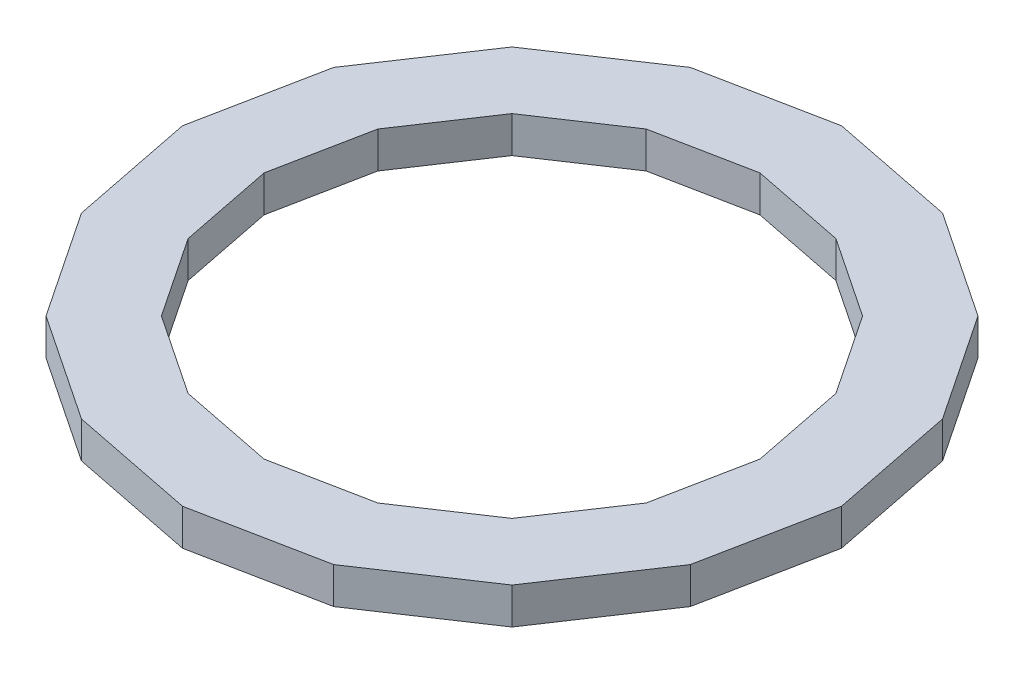
ISO-10303-21;
HEADER;
FILE_DESCRIPTION(('STEP AP214'),'2;1');
FILE_NAME('part.step','',(''),(''),'','','');
FILE_SCHEMA(('AUTOMOTIVE_DESIGN { 1 0 10303 214 1 1 1 1 }'));
ENDSEC;
DATA;
#1=APPLICATION_CONTEXT('core data for automotive mechanical design processes');
#2=APPLICATION_PROTOCOL_DEFINITION('international standard','automotive_design',2000,#1);
#3=PRODUCT_CONTEXT('',#1,'mechanical');
#4=PRODUCT('Part','Part','',(#3));
#5=PRODUCT_RELATED_PRODUCT_CATEGORY('part','',(#4));
#6=PRODUCT_DEFINITION_FORMATION('','',#4);
#7=PRODUCT_DEFINITION_CONTEXT('part definition',#1,'design');
#8=PRODUCT_DEFINITION('design','',#6,#7);
#9=PRODUCT_DEFINITION_SHAPE('','',#8);
#10=(LENGTH_UNIT() NAMED_UNIT(*) SI_UNIT(.MILLI.,.METRE.));
#11=(NAMED_UNIT(*) PLANE_ANGLE_UNIT() SI_UNIT($,.RADIAN.));
#12=(NAMED_UNIT(*) SI_UNIT($,.STERADIAN.) SOLID_ANGLE_UNIT());
#13=UNCERTAINTY_MEASURE_WITH_UNIT(LENGTH_MEASURE(1.E-05),#10,'distance_accuracy_value','');
#14=(GEOMETRIC_REPRESENTATION_CONTEXT(3) GLOBAL_UNCERTAINTY_ASSIGNED_CONTEXT((#13)) GLOBAL_UNIT_ASSIGNED_CONTEXT((#10,
#11,#12)) REPRESENTATION_CONTEXT('',''));
#15=CARTESIAN_POINT('',(0.,0.,0.));
#16=DIRECTION('',(0.,0.,1.));
#17=DIRECTION('',(1.,0.,0.));
#18=AXIS2_PLACEMENT_3D('',#15,#16,#17);
#19=CARTESIAN_POINT('',(0.,19.05,0.));
#20=DIRECTION('',(0.,1.,0.));
#21=DIRECTION('',(0.,0.,1.));
#22=AXIS2_PLACEMENT_3D('',#19,#20,#21);
#23=PLANE('',#22);
#24=DIRECTION('',(0.195090322016118,0.,-0.980785280403233));
#25=VECTOR('',#24,1.);
#26=CARTESIAN_POINT('',(159.378309212576,19.05,66.0166572239398));
#27=LINE('',#26,#25);
#28=CARTESIAN_POINT('',(159.378309212576,19.05,66.0166572239398));
#29=VERTEX_POINT('',#28);
#30=CARTESIAN_POINT('',(172.509838787481,19.05,-1.85963506638641E-12));
#31=VERTEX_POINT('',#30);
#32=EDGE_CURVE('E386',#29,#31,#27,.T.);
#33=ORIENTED_EDGE('',*,*,#32,.T.);
#34=DIRECTION('',(-0.195090322016138,0.,-0.980785280403228));
#35=VECTOR('',#34,1.);
#36=CARTESIAN_POINT('',(172.509838787481,19.05,-1.85963506638641E-12));
#37=LINE('',#36,#35);
#38=CARTESIAN_POINT('',(159.378309212575,19.05,-66.0166572239432));
#39=VERTEX_POINT('',#38);
#40=EDGE_CURVE('E390',#31,#39,#37,.T.);
#41=ORIENTED_EDGE('',*,*,#40,.T.);
#42=DIRECTION('',(-0.555570233019611,0.,-0.83146961230254));
#43=VECTOR('',#42,1.);
#44=CARTESIAN_POINT('',(159.378309212575,19.05,-66.0166572239432));
#45=LINE('',#44,#43);
#46=CARTESIAN_POINT('',(121.982876828025,19.05,-121.982876828027));
#47=VERTEX_POINT('',#46);
#48=EDGE_CURVE('E394',#39,#47,#45,.T.);
#49=ORIENTED_EDGE('',*,*,#48,.T.);
#50=DIRECTION('',(-0.831469612302551,0.,-0.555570233019593));
#51=VECTOR('',#50,1.);
#52=CARTESIAN_POINT('',(121.982876828025,19.05,-121.982876828027));
#53=LINE('',#52,#51);
#54=CARTESIAN_POINT('',(66.0166572239397,19.05,-159.378309212576));
#55=VERTEX_POINT('',#54);
#56=EDGE_CURVE('E397',#47,#55,#53,.T.);
#57=ORIENTED_EDGE('',*,*,#56,.T.);
#58=DIRECTION('',(-0.980785280403233,0.,-0.195090322016118));
#59=VECTOR('',#58,1.);
#60=CARTESIAN_POINT('',(66.0166572239397,19.05,-159.378309212576));
#61=LINE('',#60,#59);
#62=CARTESIAN_POINT('',(-1.8586320470374E-12,19.05,-172.509838787481));
#63=VERTEX_POINT('',#62);
#64=EDGE_CURVE('E400',#55,#63,#61,.T.);
#65=ORIENTED_EDGE('',*,*,#64,.T.);
#66=DIRECTION('',(-0.980785280403228,0.,0.195090322016139));
#67=VECTOR('',#66,1.);
#68=CARTESIAN_POINT('',(-1.8586320470374E-12,19.05,-172.509838787481));
#69=LINE('',#68,#67);
#70=CARTESIAN_POINT('',(-66.0166572239432,19.05,-159.378309212575));
#71=VERTEX_POINT('',#70);
#72=EDGE_CURVE('E403',#63,#71,#69,.T.);
#73=ORIENTED_EDGE('',*,*,#72,.T.);
#74=DIRECTION('',(-0.831469612302539,0.,0.555570233019611));
#75=VECTOR('',#74,1.);
#76=CARTESIAN_POINT('',(-66.0166572239432,19.05,-159.378309212575));
#77=LINE('',#76,#75);
#78=CARTESIAN_POINT('',(-121.982876828027,19.05,-121.982876828025));
#79=VERTEX_POINT('',#78);
#80=EDGE_CURVE('E405',#71,#79,#77,.T.);
#81=ORIENTED_EDGE('',*,*,#80,.T.);
#82=DIRECTION('',(-0.555570233019593,0.,0.831469612302551));
#83=VECTOR('',#82,1.);
#84=CARTESIAN_POINT('',(-121.982876828027,19.05,-121.982876828025));
#85=LINE('',#84,#83);
#86=CARTESIAN_POINT('',(-159.378309212576,19.05,-66.0166572239399));
#87=VERTEX_POINT('',#86);
#88=EDGE_CURVE('E407',#79,#87,#85,.T.);
#89=ORIENTED_EDGE('',*,*,#88,.T.);
#90=DIRECTION('',(-0.195090322016118,0.,0.980785280403233));
#91=VECTOR('',#90,1.);
#92=CARTESIAN_POINT('',(-159.378309212576,19.05,-66.0166572239399));
#93=LINE('',#92,#91);
#94=CARTESIAN_POINT('',(-172.509838787481,19.05,1.81776827667731E-12));
#95=VERTEX_POINT('',#94);
#96=EDGE_CURVE('E409',#87,#95,#93,.T.);
#97=ORIENTED_EDGE('',*,*,#96,.T.);
#98=DIRECTION('',(0.195090322016138,0.,0.980785280403228));
#99=VECTOR('',#98,1.);
#100=CARTESIAN_POINT('',(-172.509838787481,19.05,1.81776827667731E-12));
#101=LINE('',#100,#99);
#102=CARTESIAN_POINT('',(-159.378309212575,19.05,66.0166572239433));
#103=VERTEX_POINT('',#102);
#104=EDGE_CURVE('E411',#95,#103,#101,.T.);
#105=ORIENTED_EDGE('',*,*,#104,.T.);
#106=DIRECTION('',(0.555570233019611,0.,0.831469612302539));
#107=VECTOR('',#106,1.);
#108=CARTESIAN_POINT('',(-159.378309212575,19.05,66.0166572239433));
#109=LINE('',#108,#107);
#110=CARTESIAN_POINT('',(-121.982876828025,19.05,121.982876828027));
#111=VERTEX_POINT('',#110);
#112=EDGE_CURVE('E413',#103,#111,#109,.T.);
#113=ORIENTED_EDGE('',*,*,#112,.T.);
#114=DIRECTION('',(0.831469612302551,0.,0.555570233019593));
#115=VECTOR('',#114,1.);
#116=CARTESIAN_POINT('',(-121.982876828025,19.05,121.982876828027));
#117=LINE('',#116,#115);
#118=CARTESIAN_POINT('',(-66.0166572239399,19.05,159.378309212576));
#119=VERTEX_POINT('',#118);
#120=EDGE_CURVE('E415',#111,#119,#117,.T.);
#121=ORIENTED_EDGE('',*,*,#120,.T.);
#122=DIRECTION('',(0.980785280403232,0.,0.195090322016118));
#123=VECTOR('',#122,1.);
#124=CARTESIAN_POINT('',(-66.0166572239399,19.05,159.378309212576));
#125=LINE('',#124,#123);
#126=CARTESIAN_POINT('',(1.7352495104577E-12,19.05,172.509838787481));
#127=VERTEX_POINT('',#126);
#128=EDGE_CURVE('E417',#119,#127,#125,.T.);
#129=ORIENTED_EDGE('',*,*,#128,.T.);
#130=DIRECTION('',(0.980785280403228,0.,-0.195090322016139));
#131=VECTOR('',#130,1.);
#132=CARTESIAN_POINT('',(1.7352495104577E-12,19.05,172.509838787481));
#133=LINE('',#132,#131);
#134=CARTESIAN_POINT('',(66.0166572239432,19.05,159.378309212575));
#135=VERTEX_POINT('',#134);
#136=EDGE_CURVE('E419',#127,#135,#133,.T.);
#137=ORIENTED_EDGE('',*,*,#136,.T.);
#138=DIRECTION('',(0.831469612302539,0.,-0.555570233019611));
#139=VECTOR('',#138,1.);
#140=CARTESIAN_POINT('',(66.0166572239432,19.05,159.378309212575));
#141=LINE('',#140,#139);
#142=CARTESIAN_POINT('',(121.982876828027,19.05,121.982876828025));
#143=VERTEX_POINT('',#142);
#144=EDGE_CURVE('E421',#135,#143,#141,.T.);
#145=ORIENTED_EDGE('',*,*,#144,.T.);
#146=DIRECTION('',(0.555570233019594,0.,-0.831469612302551));
#147=VECTOR('',#146,1.);
#148=CARTESIAN_POINT('',(121.982876828027,19.05,121.982876828025));
#149=LINE('',#148,#147);
#150=EDGE_CURVE('E423',#143,#29,#149,.T.);
#151=ORIENTED_EDGE('',*,*,#150,.T.);
#152=EDGE_LOOP('',(#33,#41,#49,#57,#65,#73,#81,#89,#97,#105,#113,#121,#129,#137,#145,#151));
#153=FACE_BOUND('',#152,.T.);
#154=DIRECTION('',(-0.195090322016139,0.,-0.980785280403228));
#155=VECTOR('',#154,1.);
#156=CARTESIAN_POINT('',(129.77877334697,19.05,-1.42950828694669E-12));
#157=LINE('',#156,#155);
#158=CARTESIAN_POINT('',(129.77877334697,19.05,-1.42950828694669E-12));
#159=VERTEX_POINT('',#158);
#160=CARTESIAN_POINT('',(119.899952449686,19.05,-49.6641864325507));
#161=VERTEX_POINT('',#160);
#162=EDGE_CURVE('E251',#159,#161,#157,.T.);
#163=ORIENTED_EDGE('',*,*,#162,.F.);
#164=DIRECTION('',(0.195090322016118,0.,-0.980785280403232));
#165=VECTOR('',#164,1.);
#166=CARTESIAN_POINT('',(119.899952449687,19.05,49.6641864325481));
#167=LINE('',#166,#165);
#168=CARTESIAN_POINT('',(119.899952449687,19.05,49.6641864325481));
#169=VERTEX_POINT('',#168);
#170=EDGE_CURVE('E243',#169,#159,#167,.T.);
#171=ORIENTED_EDGE('',*,*,#170,.F.);
#172=DIRECTION('',(0.555570233019593,0.,-0.831469612302551));
#173=VECTOR('',#172,1.);
#174=CARTESIAN_POINT('',(91.7674506877153,19.05,91.7674506877133));
#175=LINE('',#174,#173);
#176=CARTESIAN_POINT('',(91.7674506877153,19.05,91.7674506877133));
#177=VERTEX_POINT('',#176);
#178=EDGE_CURVE('E302',#177,#169,#175,.T.);
#179=ORIENTED_EDGE('',*,*,#178,.F.);
#180=DIRECTION('',(0.831469612302539,0.,-0.555570233019611));
#181=VECTOR('',#180,1.);
#182=CARTESIAN_POINT('',(49.6641864325507,19.05,119.899952449686));
#183=LINE('',#182,#181);
#184=CARTESIAN_POINT('',(49.6641864325507,19.05,119.899952449686));
#185=VERTEX_POINT('',#184);
#186=EDGE_CURVE('E299',#185,#177,#183,.T.);
#187=ORIENTED_EDGE('',*,*,#186,.F.);
#188=DIRECTION('',(0.980785280403228,0.,-0.195090322016139));
#189=VECTOR('',#188,1.);
#190=CARTESIAN_POINT('',(1.30339335903007E-12,19.05,129.77877334697));
#191=LINE('',#190,#189);
#192=CARTESIAN_POINT('',(1.30339335903007E-12,19.05,129.77877334697));
#193=VERTEX_POINT('',#192);
#194=EDGE_CURVE('E297',#193,#185,#191,.T.);
#195=ORIENTED_EDGE('',*,*,#194,.F.);
#196=DIRECTION('',(0.980785280403232,0.,0.195090322016118));
#197=VECTOR('',#196,1.);
#198=CARTESIAN_POINT('',(-49.6641864325482,19.05,119.899952449687));
#199=LINE('',#198,#197);
#200=CARTESIAN_POINT('',(-49.6641864325482,19.05,119.899952449687));
#201=VERTEX_POINT('',#200);
#202=EDGE_CURVE('E295',#201,#193,#199,.T.);
#203=ORIENTED_EDGE('',*,*,#202,.F.);
#204=DIRECTION('',(0.831469612302551,0.,0.555570233019594));
#205=VECTOR('',#204,1.);
#206=CARTESIAN_POINT('',(-91.7674506877134,19.05,91.7674506877153));
#207=LINE('',#206,#205);
#208=CARTESIAN_POINT('',(-91.7674506877134,19.05,91.7674506877153));
#209=VERTEX_POINT('',#208);
#210=EDGE_CURVE('E292',#209,#201,#207,.T.);
#211=ORIENTED_EDGE('',*,*,#210,.F.);
#212=DIRECTION('',(0.555570233019611,0.,0.831469612302539));
#213=VECTOR('',#212,1.);
#214=CARTESIAN_POINT('',(-119.899952449686,19.05,49.6641864325508));
#215=LINE('',#214,#213);
#216=CARTESIAN_POINT('',(-119.899952449686,19.05,49.6641864325508));
#217=VERTEX_POINT('',#216);
#218=EDGE_CURVE('E290',#217,#209,#215,.T.);
#219=ORIENTED_EDGE('',*,*,#218,.F.);
#220=DIRECTION('',(0.195090322016139,0.,0.980785280403228));
#221=VECTOR('',#220,1.);
#222=CARTESIAN_POINT('',(-129.77877334697,19.05,1.42254270783524E-12));
#223=LINE('',#222,#221);
#224=CARTESIAN_POINT('',(-129.77877334697,19.05,1.42254270783524E-12));
#225=VERTEX_POINT('',#224);
#226=EDGE_CURVE('E288',#225,#217,#223,.T.);
#227=ORIENTED_EDGE('',*,*,#226,.F.);
#228=DIRECTION('',(-0.195090322016118,0.,0.980785280403233));
#229=VECTOR('',#228,1.);
#230=CARTESIAN_POINT('',(-119.899952449687,19.05,-49.6641864325481));
#231=LINE('',#230,#229);
#232=CARTESIAN_POINT('',(-119.899952449687,19.05,-49.6641864325481));
#233=VERTEX_POINT('',#232);
#234=EDGE_CURVE('E286',#233,#225,#231,.T.);
#235=ORIENTED_EDGE('',*,*,#234,.F.);
#236=DIRECTION('',(-0.555570233019594,0.,0.831469612302551));
#237=VECTOR('',#236,1.);
#238=CARTESIAN_POINT('',(-91.7674506877153,19.05,-91.7674506877133));
#239=LINE('',#238,#237);
#240=CARTESIAN_POINT('',(-91.7674506877153,19.05,-91.7674506877133));
#241=VERTEX_POINT('',#240);
#242=EDGE_CURVE('E284',#241,#233,#239,.T.);
#243=ORIENTED_EDGE('',*,*,#242,.F.);
#244=DIRECTION('',(-0.831469612302539,0.,0.555570233019611));
#245=VECTOR('',#244,1.);
#246=CARTESIAN_POINT('',(-49.6641864325507,19.05,-119.899952449686));
#247=LINE('',#246,#245);
#248=CARTESIAN_POINT('',(-49.6641864325507,19.05,-119.899952449686));
#249=VERTEX_POINT('',#248);
#250=EDGE_CURVE('E282',#249,#241,#247,.T.);
#251=ORIENTED_EDGE('',*,*,#250,.F.);
#252=DIRECTION('',(-0.980785280403228,0.,0.195090322016139));
#253=VECTOR('',#252,1.);
#254=CARTESIAN_POINT('',(-1.43634148586359E-12,19.05,-129.77877334697));
#255=LINE('',#254,#253);
#256=CARTESIAN_POINT('',(-1.43634148586359E-12,19.05,-129.77877334697));
#257=VERTEX_POINT('',#256);
#258=EDGE_CURVE('E280',#257,#249,#255,.T.);
#259=ORIENTED_EDGE('',*,*,#258,.F.);
#260=DIRECTION('',(-0.980785280403233,0.,-0.195090322016118));
#261=VECTOR('',#260,1.);
#262=CARTESIAN_POINT('',(49.6641864325483,19.05,-119.899952449687));
#263=LINE('',#262,#261);
#264=CARTESIAN_POINT('',(49.6641864325483,19.05,-119.899952449687));
#265=VERTEX_POINT('',#264);
#266=EDGE_CURVE('E277',#265,#257,#263,.T.);
#267=ORIENTED_EDGE('',*,*,#266,.F.);
#268=DIRECTION('',(-0.831469612302551,0.,-0.555570233019593));
#269=VECTOR('',#268,1.);
#270=CARTESIAN_POINT('',(91.7674506877133,19.05,-91.7674506877153));
#271=LINE('',#270,#269);
#272=CARTESIAN_POINT('',(91.7674506877133,19.05,-91.7674506877153));
#273=VERTEX_POINT('',#272);
#274=EDGE_CURVE('E272',#273,#265,#271,.T.);
#275=ORIENTED_EDGE('',*,*,#274,.F.);
#276=DIRECTION('',(-0.555570233019611,0.,-0.831469612302539));
#277=VECTOR('',#276,1.);
#278=CARTESIAN_POINT('',(119.899952449686,19.05,-49.6641864325507));
#279=LINE('',#278,#277);
#280=EDGE_CURVE('E265',#161,#273,#279,.T.);
#281=ORIENTED_EDGE('',*,*,#280,.F.);
#282=EDGE_LOOP('',(#163,#171,#179,#187,#195,#203,#211,#219,#227,#235,#243,#251,#259,#267,#275,#281));
#283=FACE_BOUND('',#282,.T.);
#284=ADVANCED_FACE('F34',(#153,#283),#23,.T.);
#285=CARTESIAN_POINT('',(0.,0.,0.));
#286=DIRECTION('',(0.,1.,0.));
#287=DIRECTION('',(0.,0.,1.));
#288=AXIS2_PLACEMENT_3D('',#285,#286,#287);
#289=PLANE('',#288);
#290=DIRECTION('',(0.195090322016118,0.,-0.980785280403233));
#291=VECTOR('',#290,1.);
#292=CARTESIAN_POINT('',(159.378309212576,0.,66.0166572239398));
#293=LINE('',#292,#291);
#294=CARTESIAN_POINT('',(159.378309212576,0.,66.0166572239398));
#295=VERTEX_POINT('',#294);
#296=CARTESIAN_POINT('',(172.509838787481,0.,-1.85963506638641E-12));
#297=VERTEX_POINT('',#296);
#298=EDGE_CURVE('E260',#295,#297,#293,.T.);
#299=ORIENTED_EDGE('',*,*,#298,.F.);
#300=DIRECTION('',(0.555570233019594,0.,-0.831469612302551));
#301=VECTOR('',#300,1.);
#302=CARTESIAN_POINT('',(121.982876828027,0.,121.982876828025));
#303=LINE('',#302,#301);
#304=CARTESIAN_POINT('',(121.982876828027,0.,121.982876828025));
#305=VERTEX_POINT('',#304);
#306=EDGE_CURVE('E391',#305,#295,#303,.T.);
#307=ORIENTED_EDGE('',*,*,#306,.F.);
#308=DIRECTION('',(0.831469612302539,0.,-0.555570233019611));
#309=VECTOR('',#308,1.);
#310=CARTESIAN_POINT('',(66.0166572239432,0.,159.378309212575));
#311=LINE('',#310,#309);
#312=CARTESIAN_POINT('',(66.0166572239432,0.,159.378309212575));
#313=VERTEX_POINT('',#312);
#314=EDGE_CURVE('E463',#313,#305,#311,.T.);
#315=ORIENTED_EDGE('',*,*,#314,.F.);
#316=DIRECTION('',(0.980785280403228,0.,-0.195090322016139));
#317=VECTOR('',#316,1.);
#318=CARTESIAN_POINT('',(1.7352495104577E-12,0.,172.509838787481));
#319=LINE('',#318,#317);
#320=CARTESIAN_POINT('',(1.7352495104577E-12,0.,172.509838787481));
#321=VERTEX_POINT('',#320);
#322=EDGE_CURVE('E460',#321,#313,#319,.T.);
#323=ORIENTED_EDGE('',*,*,#322,.F.);
#324=DIRECTION('',(0.980785280403232,0.,0.195090322016118));
#325=VECTOR('',#324,1.);
#326=CARTESIAN_POINT('',(-66.0166572239399,0.,159.378309212576));
#327=LINE('',#326,#325);
#328=CARTESIAN_POINT('',(-66.0166572239399,0.,159.378309212576));
#329=VERTEX_POINT('',#328);
#330=EDGE_CURVE('E458',#329,#321,#327,.T.);
#331=ORIENTED_EDGE('',*,*,#330,.F.);
#332=DIRECTION('',(0.831469612302551,0.,0.555570233019593));
#333=VECTOR('',#332,1.);
#334=CARTESIAN_POINT('',(-121.982876828025,0.,121.982876828027));
#335=LINE('',#334,#333);
#336=CARTESIAN_POINT('',(-121.982876828025,0.,121.982876828027));
#337=VERTEX_POINT('',#336);
#338=EDGE_CURVE('E456',#337,#329,#335,.T.);
#339=ORIENTED_EDGE('',*,*,#338,.F.);
#340=DIRECTION('',(0.555570233019611,0.,0.831469612302539));
#341=VECTOR('',#340,1.);
#342=CARTESIAN_POINT('',(-159.378309212575,0.,66.0166572239433));
#343=LINE('',#342,#341);
#344=CARTESIAN_POINT('',(-159.378309212575,0.,66.0166572239433));
#345=VERTEX_POINT('',#344);
#346=EDGE_CURVE('E453',#345,#337,#343,.T.);
#347=ORIENTED_EDGE('',*,*,#346,.F.);
#348=DIRECTION('',(0.195090322016138,0.,0.980785280403228));
#349=VECTOR('',#348,1.);
#350=CARTESIAN_POINT('',(-172.509838787481,0.,1.81776827667731E-12));
#351=LINE('',#350,#349);
#352=CARTESIAN_POINT('',(-172.509838787481,0.,1.81776827667731E-12));
#353=VERTEX_POINT('',#352);
#354=EDGE_CURVE('E451',#353,#345,#351,.T.);
#355=ORIENTED_EDGE('',*,*,#354,.F.);
#356=DIRECTION('',(-0.195090322016118,0.,0.980785280403233));
#357=VECTOR('',#356,1.);
#358=CARTESIAN_POINT('',(-159.378309212576,0.,-66.0166572239399));
#359=LINE('',#358,#357);
#360=CARTESIAN_POINT('',(-159.378309212576,0.,-66.0166572239399));
#361=VERTEX_POINT('',#360);
#362=EDGE_CURVE('E448',#361,#353,#359,.T.);
#363=ORIENTED_EDGE('',*,*,#362,.F.);
#364=DIRECTION('',(-0.555570233019593,0.,0.831469612302551));
#365=VECTOR('',#364,1.);
#366=CARTESIAN_POINT('',(-121.982876828027,0.,-121.982876828025));
#367=LINE('',#366,#365);
#368=CARTESIAN_POINT('',(-121.982876828027,0.,-121.982876828025));
#369=VERTEX_POINT('',#368);
#370=EDGE_CURVE('E446',#369,#361,#367,.T.);
#371=ORIENTED_EDGE('',*,*,#370,.F.);
#372=DIRECTION('',(-0.831469612302539,0.,0.555570233019611));
#373=VECTOR('',#372,1.);
#374=CARTESIAN_POINT('',(-66.0166572239432,0.,-159.378309212575));
#375=LINE('',#374,#373);
#376=CARTESIAN_POINT('',(-66.0166572239432,0.,-159.378309212575));
#377=VERTEX_POINT('',#376);
#378=EDGE_CURVE('E444',#377,#369,#375,.T.);
#379=ORIENTED_EDGE('',*,*,#378,.F.);
#380=DIRECTION('',(-0.980785280403228,0.,0.195090322016139));
#381=VECTOR('',#380,1.);
#382=CARTESIAN_POINT('',(-1.8586320470374E-12,0.,-172.509838787481));
#383=LINE('',#382,#381);
#384=CARTESIAN_POINT('',(-1.8586320470374E-12,0.,-172.509838787481));
#385=VERTEX_POINT('',#384);
#386=EDGE_CURVE('E442',#385,#377,#383,.T.);
#387=ORIENTED_EDGE('',*,*,#386,.F.);
#388=DIRECTION('',(-0.980785280403233,0.,-0.195090322016118));
#389=VECTOR('',#388,1.);
#390=CARTESIAN_POINT('',(66.0166572239397,0.,-159.378309212576));
#391=LINE('',#390,#389);
#392=CARTESIAN_POINT('',(66.0166572239397,0.,-159.378309212576));
#393=VERTEX_POINT('',#392);
#394=EDGE_CURVE('E439',#393,#385,#391,.T.);
#395=ORIENTED_EDGE('',*,*,#394,.F.);
#396=DIRECTION('',(-0.831469612302551,0.,-0.555570233019593));
#397=VECTOR('',#396,1.);
#398=CARTESIAN_POINT('',(121.982876828025,0.,-121.982876828027));
#399=LINE('',#398,#397);
#400=CARTESIAN_POINT('',(121.982876828025,0.,-121.982876828027));
#401=VERTEX_POINT('',#400);
#402=EDGE_CURVE('E436',#401,#393,#399,.T.);
#403=ORIENTED_EDGE('',*,*,#402,.F.);
#404=DIRECTION('',(-0.555570233019611,0.,-0.83146961230254));
#405=VECTOR('',#404,1.);
#406=CARTESIAN_POINT('',(159.378309212575,0.,-66.0166572239432));
#407=LINE('',#406,#405);
#408=CARTESIAN_POINT('',(159.378309212575,0.,-66.0166572239432));
#409=VERTEX_POINT('',#408);
#410=EDGE_CURVE('E433',#409,#401,#407,.T.);
#411=ORIENTED_EDGE('',*,*,#410,.F.);
#412=DIRECTION('',(-0.195090322016138,0.,-0.980785280403228));
#413=VECTOR('',#412,1.);
#414=CARTESIAN_POINT('',(172.509838787481,0.,-1.85963506638641E-12));
#415=LINE('',#414,#413);
#416=EDGE_CURVE('E430',#297,#409,#415,.T.);
#417=ORIENTED_EDGE('',*,*,#416,.F.);
#418=EDGE_LOOP('',(#299,#307,#315,#323,#331,#339,#347,#355,#363,#371,#379,#387,#395,#403,#411,#417));
#419=FACE_BOUND('',#418,.T.);
#420=DIRECTION('',(0.195090322016118,0.,-0.980785280403232));
#421=VECTOR('',#420,1.);
#422=CARTESIAN_POINT('',(119.899952449687,0.,49.6641864325481));
#423=LINE('',#422,#421);
#424=CARTESIAN_POINT('',(119.899952449687,0.,49.6641864325481));
#425=VERTEX_POINT('',#424);
#426=CARTESIAN_POINT('',(129.77877334697,0.,-1.42950828694669E-12));
#427=VERTEX_POINT('',#426);
#428=EDGE_CURVE('E57',#425,#427,#423,.T.);
#429=ORIENTED_EDGE('',*,*,#428,.T.);
#430=DIRECTION('',(-0.195090322016139,0.,-0.980785280403228));
#431=VECTOR('',#430,1.);
#432=CARTESIAN_POINT('',(129.77877334697,0.,-1.42950828694669E-12));
#433=LINE('',#432,#431);
#434=CARTESIAN_POINT('',(119.899952449686,0.,-49.6641864325507));
#435=VERTEX_POINT('',#434);
#436=EDGE_CURVE('E258',#427,#435,#433,.T.);
#437=ORIENTED_EDGE('',*,*,#436,.T.);
#438=DIRECTION('',(-0.555570233019611,0.,-0.831469612302539));
#439=VECTOR('',#438,1.);
#440=CARTESIAN_POINT('',(119.899952449686,0.,-49.6641864325507));
#441=LINE('',#440,#439);
#442=CARTESIAN_POINT('',(91.7674506877133,0.,-91.7674506877153));
#443=VERTEX_POINT('',#442);
#444=EDGE_CURVE('E309',#435,#443,#441,.T.);
#445=ORIENTED_EDGE('',*,*,#444,.T.);
#446=DIRECTION('',(-0.831469612302551,0.,-0.555570233019593));
#447=VECTOR('',#446,1.);
#448=CARTESIAN_POINT('',(91.7674506877133,0.,-91.7674506877153));
#449=LINE('',#448,#447);
#450=CARTESIAN_POINT('',(49.6641864325483,0.,-119.899952449687));
#451=VERTEX_POINT('',#450);
#452=EDGE_CURVE('E313',#443,#451,#449,.T.);
#453=ORIENTED_EDGE('',*,*,#452,.T.);
#454=DIRECTION('',(-0.980785280403233,0.,-0.195090322016118));
#455=VECTOR('',#454,1.);
#456=CARTESIAN_POINT('',(49.6641864325483,0.,-119.899952449687));
#457=LINE('',#456,#455);
#458=CARTESIAN_POINT('',(-1.43634148586359E-12,0.,-129.77877334697));
#459=VERTEX_POINT('',#458);
#460=EDGE_CURVE('E317',#451,#459,#457,.T.);
#461=ORIENTED_EDGE('',*,*,#460,.T.);
#462=DIRECTION('',(-0.980785280403228,0.,0.195090322016139));
#463=VECTOR('',#462,1.);
#464=CARTESIAN_POINT('',(-1.43634148586359E-12,0.,-129.77877334697));
#465=LINE('',#464,#463);
#466=CARTESIAN_POINT('',(-49.6641864325507,0.,-119.899952449686));
#467=VERTEX_POINT('',#466);
#468=EDGE_CURVE('E321',#459,#467,#465,.T.);
#469=ORIENTED_EDGE('',*,*,#468,.T.);
#470=DIRECTION('',(-0.831469612302539,0.,0.555570233019611));
#471=VECTOR('',#470,1.);
#472=CARTESIAN_POINT('',(-49.6641864325507,0.,-119.899952449686));
#473=LINE('',#472,#471);
#474=CARTESIAN_POINT('',(-91.7674506877153,0.,-91.7674506877133));
#475=VERTEX_POINT('',#474);
#476=EDGE_CURVE('E324',#467,#475,#473,.T.);
#477=ORIENTED_EDGE('',*,*,#476,.T.);
#478=DIRECTION('',(-0.555570233019594,0.,0.831469612302551));
#479=VECTOR('',#478,1.);
#480=CARTESIAN_POINT('',(-91.7674506877153,0.,-91.7674506877133));
#481=LINE('',#480,#479);
#482=CARTESIAN_POINT('',(-119.899952449687,0.,-49.6641864325481));
#483=VERTEX_POINT('',#482);
#484=EDGE_CURVE('E328',#475,#483,#481,.T.);
#485=ORIENTED_EDGE('',*,*,#484,.T.);
#486=DIRECTION('',(-0.195090322016118,0.,0.980785280403233));
#487=VECTOR('',#486,1.);
#488=CARTESIAN_POINT('',(-119.899952449687,0.,-49.6641864325481));
#489=LINE('',#488,#487);
#490=CARTESIAN_POINT('',(-129.77877334697,0.,1.42254270783524E-12));
#491=VERTEX_POINT('',#490);
#492=EDGE_CURVE('E331',#483,#491,#489,.T.);
#493=ORIENTED_EDGE('',*,*,#492,.T.);
#494=DIRECTION('',(0.195090322016139,0.,0.980785280403228));
#495=VECTOR('',#494,1.);
#496=CARTESIAN_POINT('',(-129.77877334697,0.,1.42254270783524E-12));
#497=LINE('',#496,#495);
#498=CARTESIAN_POINT('',(-119.899952449686,0.,49.6641864325508));
#499=VERTEX_POINT('',#498);
#500=EDGE_CURVE('E335',#491,#499,#497,.T.);
#501=ORIENTED_EDGE('',*,*,#500,.T.);
#502=DIRECTION('',(0.555570233019611,0.,0.831469612302539));
#503=VECTOR('',#502,1.);
#504=CARTESIAN_POINT('',(-119.899952449686,0.,49.6641864325508));
#505=LINE('',#504,#503);
#506=CARTESIAN_POINT('',(-91.7674506877134,0.,91.7674506877153));
#507=VERTEX_POINT('',#506);
#508=EDGE_CURVE('E338',#499,#507,#505,.T.);
#509=ORIENTED_EDGE('',*,*,#508,.T.);
#510=DIRECTION('',(0.831469612302551,0.,0.555570233019594));
#511=VECTOR('',#510,1.);
#512=CARTESIAN_POINT('',(-91.7674506877134,0.,91.7674506877153));
#513=LINE('',#512,#511);
#514=CARTESIAN_POINT('',(-49.6641864325482,0.,119.899952449687));
#515=VERTEX_POINT('',#514);
#516=EDGE_CURVE('E342',#507,#515,#513,.T.);
#517=ORIENTED_EDGE('',*,*,#516,.T.);
#518=DIRECTION('',(0.980785280403232,0.,0.195090322016118));
#519=VECTOR('',#518,1.);
#520=CARTESIAN_POINT('',(-49.6641864325482,0.,119.899952449687));
#521=LINE('',#520,#519);
#522=CARTESIAN_POINT('',(1.30339335903007E-12,0.,129.77877334697));
#523=VERTEX_POINT('',#522);
#524=EDGE_CURVE('E345',#515,#523,#521,.T.);
#525=ORIENTED_EDGE('',*,*,#524,.T.);
#526=DIRECTION('',(0.980785280403228,0.,-0.195090322016139));
#527=VECTOR('',#526,1.);
#528=CARTESIAN_POINT('',(1.30339335903007E-12,0.,129.77877334697));
#529=LINE('',#528,#527);
#530=CARTESIAN_POINT('',(49.6641864325507,0.,119.899952449686));
#531=VERTEX_POINT('',#530);
#532=EDGE_CURVE('E348',#523,#531,#529,.T.);
#533=ORIENTED_EDGE('',*,*,#532,.T.);
#534=DIRECTION('',(0.831469612302539,0.,-0.555570233019611));
#535=VECTOR('',#534,1.);
#536=CARTESIAN_POINT('',(49.6641864325507,0.,119.899952449686));
#537=LINE('',#536,#535);
#538=CARTESIAN_POINT('',(91.7674506877153,0.,91.7674506877133));
#539=VERTEX_POINT('',#538);
#540=EDGE_CURVE('E351',#531,#539,#537,.T.);
#541=ORIENTED_EDGE('',*,*,#540,.T.);
#542=DIRECTION('',(0.555570233019593,0.,-0.831469612302551));
#543=VECTOR('',#542,1.);
#544=CARTESIAN_POINT('',(91.7674506877153,0.,91.7674506877133));
#545=LINE('',#544,#543);
#546=EDGE_CURVE('E252',#539,#425,#545,.T.);
#547=ORIENTED_EDGE('',*,*,#546,.T.);
#548=EDGE_LOOP('',(#429,#437,#445,#453,#461,#469,#477,#485,#493,#501,#509,#517,#525,#533,#541,#547));
#549=FACE_BOUND('',#548,.T.);
#550=ADVANCED_FACE('F523',(#419,#549),#289,.F.);
#551=CARTESIAN_POINT('',(159.378309212576,19.05,66.0166572239398));
#552=DIRECTION('',(-0.980785280403233,0.,-0.195090322016118));
#553=DIRECTION('',(-0.195090322016118,0.,0.980785280403233));
#554=AXIS2_PLACEMENT_3D('',#551,#552,#553);
#555=PLANE('',#554);
#556=ORIENTED_EDGE('',*,*,#298,.T.);
#557=DIRECTION('',(0.,-1.,0.));
#558=VECTOR('',#557,1.);
#559=CARTESIAN_POINT('',(172.509838787481,19.05,-1.85963506638641E-12));
#560=LINE('',#559,#558);
#561=EDGE_CURVE('E11',#31,#297,#560,.T.);
#562=ORIENTED_EDGE('',*,*,#561,.F.);
#563=ORIENTED_EDGE('',*,*,#32,.F.);
#564=DIRECTION('',(0.,-1.,0.));
#565=VECTOR('',#564,1.);
#566=CARTESIAN_POINT('',(159.378309212576,19.05,66.0166572239398));
#567=LINE('',#566,#565);
#568=EDGE_CURVE('E426',#29,#295,#567,.T.);
#569=ORIENTED_EDGE('',*,*,#568,.T.);
#570=EDGE_LOOP('',(#556,#562,#563,#569));
#571=FACE_BOUND('',#570,.T.);
#572=ADVANCED_FACE('F36',(#571),#555,.F.);
#573=CARTESIAN_POINT('',(172.509838787481,19.05,-1.85963506638641E-12));
#574=DIRECTION('',(-0.980785280403229,0.,0.195090322016138));
#575=DIRECTION('',(0.195090322016138,0.,0.980785280403229));
#576=AXIS2_PLACEMENT_3D('',#573,#574,#575);
#577=PLANE('',#576);
#578=ORIENTED_EDGE('',*,*,#416,.T.);
#579=DIRECTION('',(0.,-1.,0.));
#580=VECTOR('',#579,1.);
#581=CARTESIAN_POINT('',(159.378309212575,19.05,-66.0166572239432));
#582=LINE('',#581,#580);
#583=EDGE_CURVE('E42',#39,#409,#582,.T.);
#584=ORIENTED_EDGE('',*,*,#583,.F.);
#585=ORIENTED_EDGE('',*,*,#40,.F.);
#586=ORIENTED_EDGE('',*,*,#561,.T.);
#587=EDGE_LOOP('',(#578,#584,#585,#586));
#588=FACE_BOUND('',#587,.T.);
#589=ADVANCED_FACE('F540',(#588),#577,.F.);
#590=CARTESIAN_POINT('',(159.378309212575,19.05,-66.0166572239432));
#591=DIRECTION('',(-0.831469612302539,0.,0.555570233019611));
#592=DIRECTION('',(0.555570233019611,0.,0.83146961230254));
#593=AXIS2_PLACEMENT_3D('',#590,#591,#592);
#594=PLANE('',#593);
#595=ORIENTED_EDGE('',*,*,#410,.T.);
#596=DIRECTION('',(0.,-1.,0.));
#597=VECTOR('',#596,1.);
#598=CARTESIAN_POINT('',(121.982876828025,19.05,-121.982876828027));
#599=LINE('',#598,#597);
#600=EDGE_CURVE('E506',#47,#401,#599,.T.);
#601=ORIENTED_EDGE('',*,*,#600,.F.);
#602=ORIENTED_EDGE('',*,*,#48,.F.);
#603=ORIENTED_EDGE('',*,*,#583,.T.);
#604=EDGE_LOOP('',(#595,#601,#602,#603));
#605=FACE_BOUND('',#604,.T.);
#606=ADVANCED_FACE('F517',(#605),#594,.F.);
#607=CARTESIAN_POINT('',(121.982876828025,19.05,-121.982876828027));
#608=DIRECTION('',(-0.555570233019593,0.,0.831469612302551));
#609=DIRECTION('',(0.831469612302552,0.,0.555570233019593));
#610=AXIS2_PLACEMENT_3D('',#607,#608,#609);
#611=PLANE('',#610);
#612=ORIENTED_EDGE('',*,*,#402,.T.);
#613=DIRECTION('',(0.,-1.,0.));
#614=VECTOR('',#613,1.);
#615=CARTESIAN_POINT('',(66.0166572239397,19.05,-159.378309212576));
#616=LINE('',#615,#614);
#617=EDGE_CURVE('E502',#55,#393,#616,.T.);
#618=ORIENTED_EDGE('',*,*,#617,.F.);
#619=ORIENTED_EDGE('',*,*,#56,.F.);
#620=ORIENTED_EDGE('',*,*,#600,.T.);
#621=EDGE_LOOP('',(#612,#618,#619,#620));
#622=FACE_BOUND('',#621,.T.);
#623=ADVANCED_FACE('F529',(#622),#611,.F.);
#624=CARTESIAN_POINT('',(66.0166572239397,19.05,-159.378309212576));
#625=DIRECTION('',(-0.195090322016118,0.,0.980785280403232));
#626=DIRECTION('',(0.980785280403233,0.,0.195090322016118));
#627=AXIS2_PLACEMENT_3D('',#624,#625,#626);
#628=PLANE('',#627);
#629=ORIENTED_EDGE('',*,*,#394,.T.);
#630=DIRECTION('',(0.,-1.,0.));
#631=VECTOR('',#630,1.);
#632=CARTESIAN_POINT('',(-1.8586320470374E-12,19.05,-172.509838787481));
#633=LINE('',#632,#631);
#634=EDGE_CURVE('E499',#63,#385,#633,.T.);
#635=ORIENTED_EDGE('',*,*,#634,.F.);
#636=ORIENTED_EDGE('',*,*,#64,.F.);
#637=ORIENTED_EDGE('',*,*,#617,.T.);
#638=EDGE_LOOP('',(#629,#635,#636,#637));
#639=FACE_BOUND('',#638,.T.);
#640=ADVANCED_FACE('F533',(#639),#628,.F.);
#641=CARTESIAN_POINT('',(-1.8586320470374E-12,19.05,-172.509838787481));
#642=DIRECTION('',(0.195090322016139,0.,0.980785280403228));
#643=DIRECTION('',(0.980785280403229,0.,-0.195090322016139));
#644=AXIS2_PLACEMENT_3D('',#641,#642,#643);
#645=PLANE('',#644);
#646=ORIENTED_EDGE('',*,*,#386,.T.);
#647=DIRECTION('',(0.,-1.,0.));
#648=VECTOR('',#647,1.);
#649=CARTESIAN_POINT('',(-66.0166572239432,19.05,-159.378309212575));
#650=LINE('',#649,#648);
#651=EDGE_CURVE('E496',#71,#377,#650,.T.);
#652=ORIENTED_EDGE('',*,*,#651,.F.);
#653=ORIENTED_EDGE('',*,*,#72,.F.);
#654=ORIENTED_EDGE('',*,*,#634,.T.);
#655=EDGE_LOOP('',(#646,#652,#653,#654));
#656=FACE_BOUND('',#655,.T.);
#657=ADVANCED_FACE('F593',(#656),#645,.F.);
#658=CARTESIAN_POINT('',(-66.0166572239432,19.05,-159.378309212575));
#659=DIRECTION('',(0.555570233019611,0.,0.831469612302539));
#660=DIRECTION('',(0.831469612302539,0.,-0.555570233019611));
#661=AXIS2_PLACEMENT_3D('',#658,#659,#660);
#662=PLANE('',#661);
#663=ORIENTED_EDGE('',*,*,#378,.T.);
#664=DIRECTION('',(0.,-1.,0.));
#665=VECTOR('',#664,1.);
#666=CARTESIAN_POINT('',(-121.982876828027,19.05,-121.982876828025));
#667=LINE('',#666,#665);
#668=EDGE_CURVE('E493',#79,#369,#667,.T.);
#669=ORIENTED_EDGE('',*,*,#668,.F.);
#670=ORIENTED_EDGE('',*,*,#80,.F.);
#671=ORIENTED_EDGE('',*,*,#651,.T.);
#672=EDGE_LOOP('',(#663,#669,#670,#671));
#673=FACE_BOUND('',#672,.T.);
#674=ADVANCED_FACE('F590',(#673),#662,.F.);
#675=CARTESIAN_POINT('',(-121.982876828027,19.05,-121.982876828025));
#676=DIRECTION('',(0.831469612302551,0.,0.555570233019593));
#677=DIRECTION('',(0.555570233019593,0.,-0.831469612302551));
#678=AXIS2_PLACEMENT_3D('',#675,#676,#677);
#679=PLANE('',#678);
#680=ORIENTED_EDGE('',*,*,#370,.T.);
#681=DIRECTION('',(0.,-1.,0.));
#682=VECTOR('',#681,1.);
#683=CARTESIAN_POINT('',(-159.378309212576,19.05,-66.0166572239399));
#684=LINE('',#683,#682);
#685=EDGE_CURVE('E490',#87,#361,#684,.T.);
#686=ORIENTED_EDGE('',*,*,#685,.F.);
#687=ORIENTED_EDGE('',*,*,#88,.F.);
#688=ORIENTED_EDGE('',*,*,#668,.T.);
#689=EDGE_LOOP('',(#680,#686,#687,#688));
#690=FACE_BOUND('',#689,.T.);
#691=ADVANCED_FACE('F586',(#690),#679,.F.);
#692=CARTESIAN_POINT('',(-159.378309212576,19.05,-66.0166572239399));
#693=DIRECTION('',(0.980785280403233,0.,0.195090322016118));
#694=DIRECTION('',(0.195090322016118,0.,-0.980785280403233));
#695=AXIS2_PLACEMENT_3D('',#692,#693,#694);
#696=PLANE('',#695);
#697=ORIENTED_EDGE('',*,*,#362,.T.);
#698=DIRECTION('',(0.,-1.,0.));
#699=VECTOR('',#698,1.);
#700=CARTESIAN_POINT('',(-172.509838787481,19.05,1.81776827667731E-12));
#701=LINE('',#700,#699);
#702=EDGE_CURVE('E487',#95,#353,#701,.T.);
#703=ORIENTED_EDGE('',*,*,#702,.F.);
#704=ORIENTED_EDGE('',*,*,#96,.F.);
#705=ORIENTED_EDGE('',*,*,#685,.T.);
#706=EDGE_LOOP('',(#697,#703,#704,#705));
#707=FACE_BOUND('',#706,.T.);
#708=ADVANCED_FACE('F582',(#707),#696,.F.);
#709=CARTESIAN_POINT('',(-172.509838787481,19.05,1.81776827667731E-12));
#710=DIRECTION('',(0.980785280403228,0.,-0.195090322016138));
#711=DIRECTION('',(-0.195090322016138,0.,-0.980785280403228));
#712=AXIS2_PLACEMENT_3D('',#709,#710,#711);
#713=PLANE('',#712);
#714=ORIENTED_EDGE('',*,*,#354,.T.);
#715=DIRECTION('',(0.,-1.,0.));
#716=VECTOR('',#715,1.);
#717=CARTESIAN_POINT('',(-159.378309212575,19.05,66.0166572239433));
#718=LINE('',#717,#716);
#719=EDGE_CURVE('E484',#103,#345,#718,.T.);
#720=ORIENTED_EDGE('',*,*,#719,.F.);
#721=ORIENTED_EDGE('',*,*,#104,.F.);
#722=ORIENTED_EDGE('',*,*,#702,.T.);
#723=EDGE_LOOP('',(#714,#720,#721,#722));
#724=FACE_BOUND('',#723,.T.);
#725=ADVANCED_FACE('F577',(#724),#713,.F.);
#726=CARTESIAN_POINT('',(-159.378309212575,19.05,66.0166572239433));
#727=DIRECTION('',(0.831469612302539,0.,-0.555570233019611));
#728=DIRECTION('',(-0.555570233019611,0.,-0.831469612302539));
#729=AXIS2_PLACEMENT_3D('',#726,#727,#728);
#730=PLANE('',#729);
#731=ORIENTED_EDGE('',*,*,#346,.T.);
#732=DIRECTION('',(0.,-1.,0.));
#733=VECTOR('',#732,1.);
#734=CARTESIAN_POINT('',(-121.982876828025,19.05,121.982876828027));
#735=LINE('',#734,#733);
#736=EDGE_CURVE('E481',#111,#337,#735,.T.);
#737=ORIENTED_EDGE('',*,*,#736,.F.);
#738=ORIENTED_EDGE('',*,*,#112,.F.);
#739=ORIENTED_EDGE('',*,*,#719,.T.);
#740=EDGE_LOOP('',(#731,#737,#738,#739));
#741=FACE_BOUND('',#740,.T.);
#742=ADVANCED_FACE('F571',(#741),#730,.F.);
#743=CARTESIAN_POINT('',(-121.982876828025,19.05,121.982876828027));
#744=DIRECTION('',(0.555570233019593,0.,-0.831469612302551));
#745=DIRECTION('',(-0.831469612302551,0.,-0.555570233019593));
#746=AXIS2_PLACEMENT_3D('',#743,#744,#745);
#747=PLANE('',#746);
#748=ORIENTED_EDGE('',*,*,#338,.T.);
#749=DIRECTION('',(0.,-1.,0.));
#750=VECTOR('',#749,1.);
#751=CARTESIAN_POINT('',(-66.0166572239399,19.05,159.378309212576));
#752=LINE('',#751,#750);
#753=EDGE_CURVE('E478',#119,#329,#752,.T.);
#754=ORIENTED_EDGE('',*,*,#753,.F.);
#755=ORIENTED_EDGE('',*,*,#120,.F.);
#756=ORIENTED_EDGE('',*,*,#736,.T.);
#757=EDGE_LOOP('',(#748,#754,#755,#756));
#758=FACE_BOUND('',#757,.T.);
#759=ADVANCED_FACE('F567',(#758),#747,.F.);
#760=CARTESIAN_POINT('',(-66.0166572239399,19.05,159.378309212576));
#761=DIRECTION('',(0.195090322016118,0.,-0.980785280403232));
#762=DIRECTION('',(-0.980785280403232,0.,-0.195090322016118));
#763=AXIS2_PLACEMENT_3D('',#760,#761,#762);
#764=PLANE('',#763);
#765=ORIENTED_EDGE('',*,*,#330,.T.);
#766=DIRECTION('',(0.,-1.,0.));
#767=VECTOR('',#766,1.);
#768=CARTESIAN_POINT('',(1.7352495104577E-12,19.05,172.509838787481));
#769=LINE('',#768,#767);
#770=EDGE_CURVE('E475',#127,#321,#769,.T.);
#771=ORIENTED_EDGE('',*,*,#770,.F.);
#772=ORIENTED_EDGE('',*,*,#128,.F.);
#773=ORIENTED_EDGE('',*,*,#753,.T.);
#774=EDGE_LOOP('',(#765,#771,#772,#773));
#775=FACE_BOUND('',#774,.T.);
#776=ADVANCED_FACE('F562',(#775),#764,.F.);
#777=CARTESIAN_POINT('',(1.7352495104577E-12,19.05,172.509838787481));
#778=DIRECTION('',(-0.195090322016139,0.,-0.980785280403228));
#779=DIRECTION('',(-0.980785280403228,0.,0.195090322016139));
#780=AXIS2_PLACEMENT_3D('',#777,#778,#779);
#781=PLANE('',#780);
#782=ORIENTED_EDGE('',*,*,#322,.T.);
#783=DIRECTION('',(0.,-1.,0.));
#784=VECTOR('',#783,1.);
#785=CARTESIAN_POINT('',(66.0166572239432,19.05,159.378309212575));
#786=LINE('',#785,#784);
#787=EDGE_CURVE('E472',#135,#313,#786,.T.);
#788=ORIENTED_EDGE('',*,*,#787,.F.);
#789=ORIENTED_EDGE('',*,*,#136,.F.);
#790=ORIENTED_EDGE('',*,*,#770,.T.);
#791=EDGE_LOOP('',(#782,#788,#789,#790));
#792=FACE_BOUND('',#791,.T.);
#793=ADVANCED_FACE('F556',(#792),#781,.F.);
#794=CARTESIAN_POINT('',(66.0166572239432,19.05,159.378309212575));
#795=DIRECTION('',(-0.555570233019611,0.,-0.831469612302539));
#796=DIRECTION('',(-0.831469612302539,0.,0.555570233019611));
#797=AXIS2_PLACEMENT_3D('',#794,#795,#796);
#798=PLANE('',#797);
#799=ORIENTED_EDGE('',*,*,#314,.T.);
#800=DIRECTION('',(0.,-1.,0.));
#801=VECTOR('',#800,1.);
#802=CARTESIAN_POINT('',(121.982876828027,19.05,121.982876828025));
#803=LINE('',#802,#801);
#804=EDGE_CURVE('E469',#143,#305,#803,.T.);
#805=ORIENTED_EDGE('',*,*,#804,.F.);
#806=ORIENTED_EDGE('',*,*,#144,.F.);
#807=ORIENTED_EDGE('',*,*,#787,.T.);
#808=EDGE_LOOP('',(#799,#805,#806,#807));
#809=FACE_BOUND('',#808,.T.);
#810=ADVANCED_FACE('F552',(#809),#798,.F.);
#811=CARTESIAN_POINT('',(121.982876828027,19.05,121.982876828025));
#812=DIRECTION('',(-0.831469612302551,0.,-0.555570233019594));
#813=DIRECTION('',(-0.555570233019594,0.,0.831469612302551));
#814=AXIS2_PLACEMENT_3D('',#811,#812,#813);
#815=PLANE('',#814);
#816=ORIENTED_EDGE('',*,*,#306,.T.);
#817=ORIENTED_EDGE('',*,*,#568,.F.);
#818=ORIENTED_EDGE('',*,*,#150,.F.);
#819=ORIENTED_EDGE('',*,*,#804,.T.);
#820=EDGE_LOOP('',(#816,#817,#818,#819));
#821=FACE_BOUND('',#820,.T.);
#822=ADVANCED_FACE('F547',(#821),#815,.F.);
#823=CARTESIAN_POINT('',(119.899952449687,19.05,49.6641864325481));
#824=DIRECTION('',(-0.980785280403232,0.,-0.195090322016118));
#825=DIRECTION('',(-0.195090322016118,0.,0.980785280403233));
#826=AXIS2_PLACEMENT_3D('',#823,#824,#825);
#827=PLANE('',#826);
#828=ORIENTED_EDGE('',*,*,#428,.F.);
#829=DIRECTION('',(0.,-1.,0.));
#830=VECTOR('',#829,1.);
#831=CARTESIAN_POINT('',(119.899952449687,19.05,49.6641864325481));
#832=LINE('',#831,#830);
#833=EDGE_CURVE('E247',#169,#425,#832,.T.);
#834=ORIENTED_EDGE('',*,*,#833,.F.);
#835=ORIENTED_EDGE('',*,*,#170,.T.);
#836=DIRECTION('',(0.,-1.,0.));
#837=VECTOR('',#836,1.);
#838=CARTESIAN_POINT('',(129.77877334697,19.05,-1.42950828694669E-12));
#839=LINE('',#838,#837);
#840=EDGE_CURVE('E246',#159,#427,#839,.T.);
#841=ORIENTED_EDGE('',*,*,#840,.T.);
#842=EDGE_LOOP('',(#828,#834,#835,#841));
#843=FACE_BOUND('',#842,.T.);
#844=ADVANCED_FACE('F245',(#843),#827,.T.);
#845=CARTESIAN_POINT('',(129.77877334697,19.05,-1.42950828694669E-12));
#846=DIRECTION('',(-0.980785280403228,0.,0.195090322016139));
#847=DIRECTION('',(0.195090322016139,0.,0.980785280403228));
#848=AXIS2_PLACEMENT_3D('',#845,#846,#847);
#849=PLANE('',#848);
#850=ORIENTED_EDGE('',*,*,#436,.F.);
#851=ORIENTED_EDGE('',*,*,#840,.F.);
#852=ORIENTED_EDGE('',*,*,#162,.T.);
#853=DIRECTION('',(0.,-1.,0.));
#854=VECTOR('',#853,1.);
#855=CARTESIAN_POINT('',(119.899952449686,19.05,-49.6641864325507));
#856=LINE('',#855,#854);
#857=EDGE_CURVE('E261',#161,#435,#856,.T.);
#858=ORIENTED_EDGE('',*,*,#857,.T.);
#859=EDGE_LOOP('',(#850,#851,#852,#858));
#860=FACE_BOUND('',#859,.T.);
#861=ADVANCED_FACE('F255',(#860),#849,.T.);
#862=CARTESIAN_POINT('',(119.899952449686,19.05,-49.6641864325507));
#863=DIRECTION('',(-0.831469612302539,0.,0.555570233019611));
#864=DIRECTION('',(0.555570233019611,0.,0.831469612302539));
#865=AXIS2_PLACEMENT_3D('',#862,#863,#864);
#866=PLANE('',#865);
#867=ORIENTED_EDGE('',*,*,#444,.F.);
#868=ORIENTED_EDGE('',*,*,#857,.F.);
#869=ORIENTED_EDGE('',*,*,#280,.T.);
#870=DIRECTION('',(0.,-1.,0.));
#871=VECTOR('',#870,1.);
#872=CARTESIAN_POINT('',(91.7674506877133,19.05,-91.7674506877153));
#873=LINE('',#872,#871);
#874=EDGE_CURVE('E382',#273,#443,#873,.T.);
#875=ORIENTED_EDGE('',*,*,#874,.T.);
#876=EDGE_LOOP('',(#867,#868,#869,#875));
#877=FACE_BOUND('',#876,.T.);
#878=ADVANCED_FACE('F675',(#877),#866,.T.);
#879=CARTESIAN_POINT('',(91.7674506877133,19.05,-91.7674506877153));
#880=DIRECTION('',(-0.555570233019593,0.,0.831469612302551));
#881=DIRECTION('',(0.831469612302551,0.,0.555570233019593));
#882=AXIS2_PLACEMENT_3D('',#879,#880,#881);
#883=PLANE('',#882);
#884=ORIENTED_EDGE('',*,*,#452,.F.);
#885=ORIENTED_EDGE('',*,*,#874,.F.);
#886=ORIENTED_EDGE('',*,*,#274,.T.);
#887=DIRECTION('',(0.,-1.,0.));
#888=VECTOR('',#887,1.);
#889=CARTESIAN_POINT('',(49.6641864325483,19.05,-119.899952449687));
#890=LINE('',#889,#888);
#891=EDGE_CURVE('E380',#265,#451,#890,.T.);
#892=ORIENTED_EDGE('',*,*,#891,.T.);
#893=EDGE_LOOP('',(#884,#885,#886,#892));
#894=FACE_BOUND('',#893,.T.);
#895=ADVANCED_FACE('F681',(#894),#883,.T.);
#896=CARTESIAN_POINT('',(49.6641864325483,19.05,-119.899952449687));
#897=DIRECTION('',(-0.195090322016118,0.,0.980785280403233));
#898=DIRECTION('',(0.980785280403233,0.,0.195090322016118));
#899=AXIS2_PLACEMENT_3D('',#896,#897,#898);
#900=PLANE('',#899);
#901=ORIENTED_EDGE('',*,*,#460,.F.);
#902=ORIENTED_EDGE('',*,*,#891,.F.);
#903=ORIENTED_EDGE('',*,*,#266,.T.);
#904=DIRECTION('',(0.,-1.,0.));
#905=VECTOR('',#904,1.);
#906=CARTESIAN_POINT('',(-1.43634148586359E-12,19.05,-129.77877334697));
#907=LINE('',#906,#905);
#908=EDGE_CURVE('E378',#257,#459,#907,.T.);
#909=ORIENTED_EDGE('',*,*,#908,.T.);
#910=EDGE_LOOP('',(#901,#902,#903,#909));
#911=FACE_BOUND('',#910,.T.);
#912=ADVANCED_FACE('F689',(#911),#900,.T.);
#913=CARTESIAN_POINT('',(-1.43634148586359E-12,19.05,-129.77877334697));
#914=DIRECTION('',(0.195090322016139,0.,0.980785280403228));
#915=DIRECTION('',(0.980785280403228,0.,-0.195090322016139));
#916=AXIS2_PLACEMENT_3D('',#913,#914,#915);
#917=PLANE('',#916);
#918=ORIENTED_EDGE('',*,*,#468,.F.);
#919=ORIENTED_EDGE('',*,*,#908,.F.);
#920=ORIENTED_EDGE('',*,*,#258,.T.);
#921=DIRECTION('',(0.,-1.,0.));
#922=VECTOR('',#921,1.);
#923=CARTESIAN_POINT('',(-49.6641864325507,19.05,-119.899952449686));
#924=LINE('',#923,#922);
#925=EDGE_CURVE('E376',#249,#467,#924,.T.);
#926=ORIENTED_EDGE('',*,*,#925,.T.);
#927=EDGE_LOOP('',(#918,#919,#920,#926));
#928=FACE_BOUND('',#927,.T.);
#929=ADVANCED_FACE('F698',(#928),#917,.T.);
#930=CARTESIAN_POINT('',(-49.6641864325507,19.05,-119.899952449686));
#931=DIRECTION('',(0.555570233019611,0.,0.831469612302539));
#932=DIRECTION('',(0.831469612302539,0.,-0.555570233019611));
#933=AXIS2_PLACEMENT_3D('',#930,#931,#932);
#934=PLANE('',#933);
#935=ORIENTED_EDGE('',*,*,#476,.F.);
#936=ORIENTED_EDGE('',*,*,#925,.F.);
#937=ORIENTED_EDGE('',*,*,#250,.T.);
#938=DIRECTION('',(0.,-1.,0.));
#939=VECTOR('',#938,1.);
#940=CARTESIAN_POINT('',(-91.7674506877153,19.05,-91.7674506877133));
#941=LINE('',#940,#939);
#942=EDGE_CURVE('E374',#241,#475,#941,.T.);
#943=ORIENTED_EDGE('',*,*,#942,.T.);
#944=EDGE_LOOP('',(#935,#936,#937,#943));
#945=FACE_BOUND('',#944,.T.);
#946=ADVANCED_FACE('F705',(#945),#934,.T.);
#947=CARTESIAN_POINT('',(-91.7674506877153,19.05,-91.7674506877133));
#948=DIRECTION('',(0.831469612302551,0.,0.555570233019594));
#949=DIRECTION('',(0.555570233019594,0.,-0.831469612302551));
#950=AXIS2_PLACEMENT_3D('',#947,#948,#949);
#951=PLANE('',#950);
#952=ORIENTED_EDGE('',*,*,#484,.F.);
#953=ORIENTED_EDGE('',*,*,#942,.F.);
#954=ORIENTED_EDGE('',*,*,#242,.T.);
#955=DIRECTION('',(0.,-1.,0.));
#956=VECTOR('',#955,1.);
#957=CARTESIAN_POINT('',(-119.899952449687,19.05,-49.6641864325481));
#958=LINE('',#957,#956);
#959=EDGE_CURVE('E372',#233,#483,#958,.T.);
#960=ORIENTED_EDGE('',*,*,#959,.T.);
#961=EDGE_LOOP('',(#952,#953,#954,#960));
#962=FACE_BOUND('',#961,.T.);
#963=ADVANCED_FACE('F713',(#962),#951,.T.);
#964=CARTESIAN_POINT('',(-119.899952449687,19.05,-49.6641864325481));
#965=DIRECTION('',(0.980785280403233,0.,0.195090322016118));
#966=DIRECTION('',(0.195090322016118,0.,-0.980785280403233));
#967=AXIS2_PLACEMENT_3D('',#964,#965,#966);
#968=PLANE('',#967);
#969=ORIENTED_EDGE('',*,*,#492,.F.);
#970=ORIENTED_EDGE('',*,*,#959,.F.);
#971=ORIENTED_EDGE('',*,*,#234,.T.);
#972=DIRECTION('',(0.,-1.,0.));
#973=VECTOR('',#972,1.);
#974=CARTESIAN_POINT('',(-129.77877334697,19.05,1.42254270783524E-12));
#975=LINE('',#974,#973);
#976=EDGE_CURVE('E370',#225,#491,#975,.T.);
#977=ORIENTED_EDGE('',*,*,#976,.T.);
#978=EDGE_LOOP('',(#969,#970,#971,#977));
#979=FACE_BOUND('',#978,.T.);
#980=ADVANCED_FACE('F721',(#979),#968,.T.);
#981=CARTESIAN_POINT('',(-129.77877334697,19.05,1.42254270783524E-12));
#982=DIRECTION('',(0.980785280403228,0.,-0.195090322016139));
#983=DIRECTION('',(-0.195090322016139,0.,-0.980785280403228));
#984=AXIS2_PLACEMENT_3D('',#981,#982,#983);
#985=PLANE('',#984);
#986=ORIENTED_EDGE('',*,*,#500,.F.);
#987=ORIENTED_EDGE('',*,*,#976,.F.);
#988=ORIENTED_EDGE('',*,*,#226,.T.);
#989=DIRECTION('',(0.,-1.,0.));
#990=VECTOR('',#989,1.);
#991=CARTESIAN_POINT('',(-119.899952449686,19.05,49.6641864325508));
#992=LINE('',#991,#990);
#993=EDGE_CURVE('E368',#217,#499,#992,.T.);
#994=ORIENTED_EDGE('',*,*,#993,.T.);
#995=EDGE_LOOP('',(#986,#987,#988,#994));
#996=FACE_BOUND('',#995,.T.);
#997=ADVANCED_FACE('F728',(#996),#985,.T.);
#998=CARTESIAN_POINT('',(-119.899952449686,19.05,49.6641864325508));
#999=DIRECTION('',(0.831469612302539,0.,-0.555570233019611));
#1000=DIRECTION('',(-0.555570233019611,0.,-0.831469612302539));
#1001=AXIS2_PLACEMENT_3D('',#998,#999,#1000);
#1002=PLANE('',#1001);
#1003=ORIENTED_EDGE('',*,*,#508,.F.);
#1004=ORIENTED_EDGE('',*,*,#993,.F.);
#1005=ORIENTED_EDGE('',*,*,#218,.T.);
#1006=DIRECTION('',(0.,-1.,0.));
#1007=VECTOR('',#1006,1.);
#1008=CARTESIAN_POINT('',(-91.7674506877134,19.05,91.7674506877153));
#1009=LINE('',#1008,#1007);
#1010=EDGE_CURVE('E366',#209,#507,#1009,.T.);
#1011=ORIENTED_EDGE('',*,*,#1010,.T.);
#1012=EDGE_LOOP('',(#1003,#1004,#1005,#1011));
#1013=FACE_BOUND('',#1012,.T.);
#1014=ADVANCED_FACE('F736',(#1013),#1002,.T.);
#1015=CARTESIAN_POINT('',(-91.7674506877134,19.05,91.7674506877153));
#1016=DIRECTION('',(0.555570233019594,0.,-0.831469612302551));
#1017=DIRECTION('',(-0.831469612302551,0.,-0.555570233019594));
#1018=AXIS2_PLACEMENT_3D('',#1015,#1016,#1017);
#1019=PLANE('',#1018);
#1020=ORIENTED_EDGE('',*,*,#516,.F.);
#1021=ORIENTED_EDGE('',*,*,#1010,.F.);
#1022=ORIENTED_EDGE('',*,*,#210,.T.);
#1023=DIRECTION('',(0.,-1.,0.));
#1024=VECTOR('',#1023,1.);
#1025=CARTESIAN_POINT('',(-49.6641864325482,19.05,119.899952449687));
#1026=LINE('',#1025,#1024);
#1027=EDGE_CURVE('E364',#201,#515,#1026,.T.);
#1028=ORIENTED_EDGE('',*,*,#1027,.T.);
#1029=EDGE_LOOP('',(#1020,#1021,#1022,#1028));
#1030=FACE_BOUND('',#1029,.T.);
#1031=ADVANCED_FACE('F744',(#1030),#1019,.T.);
#1032=CARTESIAN_POINT('',(-49.6641864325482,19.05,119.899952449687));
#1033=DIRECTION('',(0.195090322016118,0.,-0.980785280403232));
#1034=DIRECTION('',(-0.980785280403233,0.,-0.195090322016118));
#1035=AXIS2_PLACEMENT_3D('',#1032,#1033,#1034);
#1036=PLANE('',#1035);
#1037=ORIENTED_EDGE('',*,*,#524,.F.);
#1038=ORIENTED_EDGE('',*,*,#1027,.F.);
#1039=ORIENTED_EDGE('',*,*,#202,.T.);
#1040=DIRECTION('',(0.,-1.,0.));
#1041=VECTOR('',#1040,1.);
#1042=CARTESIAN_POINT('',(1.30339335903007E-12,19.05,129.77877334697));
#1043=LINE('',#1042,#1041);
#1044=EDGE_CURVE('E362',#193,#523,#1043,.T.);
#1045=ORIENTED_EDGE('',*,*,#1044,.T.);
#1046=EDGE_LOOP('',(#1037,#1038,#1039,#1045));
#1047=FACE_BOUND('',#1046,.T.);
#1048=ADVANCED_FACE('F751',(#1047),#1036,.T.);
#1049=CARTESIAN_POINT('',(1.30339335903007E-12,19.05,129.77877334697));
#1050=DIRECTION('',(-0.195090322016139,0.,-0.980785280403228));
#1051=DIRECTION('',(-0.980785280403229,0.,0.195090322016139));
#1052=AXIS2_PLACEMENT_3D('',#1049,#1050,#1051);
#1053=PLANE('',#1052);
#1054=ORIENTED_EDGE('',*,*,#532,.F.);
#1055=ORIENTED_EDGE('',*,*,#1044,.F.);
#1056=ORIENTED_EDGE('',*,*,#194,.T.);
#1057=DIRECTION('',(0.,-1.,0.));
#1058=VECTOR('',#1057,1.);
#1059=CARTESIAN_POINT('',(49.6641864325507,19.05,119.899952449686));
#1060=LINE('',#1059,#1058);
#1061=EDGE_CURVE('E360',#185,#531,#1060,.T.);
#1062=ORIENTED_EDGE('',*,*,#1061,.T.);
#1063=EDGE_LOOP('',(#1054,#1055,#1056,#1062));
#1064=FACE_BOUND('',#1063,.T.);
#1065=ADVANCED_FACE('F759',(#1064),#1053,.T.);
#1066=CARTESIAN_POINT('',(49.6641864325507,19.05,119.899952449686));
#1067=DIRECTION('',(-0.555570233019611,0.,-0.831469612302539));
#1068=DIRECTION('',(-0.831469612302539,0.,0.555570233019611));
#1069=AXIS2_PLACEMENT_3D('',#1066,#1067,#1068);
#1070=PLANE('',#1069);
#1071=ORIENTED_EDGE('',*,*,#540,.F.);
#1072=ORIENTED_EDGE('',*,*,#1061,.F.);
#1073=ORIENTED_EDGE('',*,*,#186,.T.);
#1074=DIRECTION('',(0.,-1.,0.));
#1075=VECTOR('',#1074,1.);
#1076=CARTESIAN_POINT('',(91.7674506877153,19.05,91.7674506877133));
#1077=LINE('',#1076,#1075);
#1078=EDGE_CURVE('E49',#177,#539,#1077,.T.);
#1079=ORIENTED_EDGE('',*,*,#1078,.T.);
#1080=EDGE_LOOP('',(#1071,#1072,#1073,#1079));
#1081=FACE_BOUND('',#1080,.T.);
#1082=ADVANCED_FACE('F767',(#1081),#1070,.T.);
#1083=CARTESIAN_POINT('',(91.7674506877153,19.05,91.7674506877133));
#1084=DIRECTION('',(-0.831469612302551,0.,-0.555570233019594));
#1085=DIRECTION('',(-0.555570233019594,0.,0.831469612302551));
#1086=AXIS2_PLACEMENT_3D('',#1083,#1084,#1085);
#1087=PLANE('',#1086);
#1088=ORIENTED_EDGE('',*,*,#546,.F.);
#1089=ORIENTED_EDGE('',*,*,#1078,.F.);
#1090=ORIENTED_EDGE('',*,*,#178,.T.);
#1091=ORIENTED_EDGE('',*,*,#833,.T.);
#1092=EDGE_LOOP('',(#1088,#1089,#1090,#1091));
#1093=FACE_BOUND('',#1092,.T.);
#1094=ADVANCED_FACE('F775',(#1093),#1087,.T.);
#1095=CLOSED_SHELL('',(#284,#550,#572,#589,#606,#623,#640,#657,#674,#691,#708,#725,#742,#759,
#776,#793,#810,#822,#844,#861,#878,#895,#912,#929,#946,#963,#980,#997,#1014,#1031,#1048,#1065,
#1082,#1094));
#1096=MANIFOLD_SOLID_BREP('B2',#1095);
#1097=ADVANCED_BREP_SHAPE_REPRESENTATION('',(#18,#1096),#14);
#1098=SHAPE_DEFINITION_REPRESENTATION(#9,#1097);
ENDSEC;
END-ISO-10303-21;
